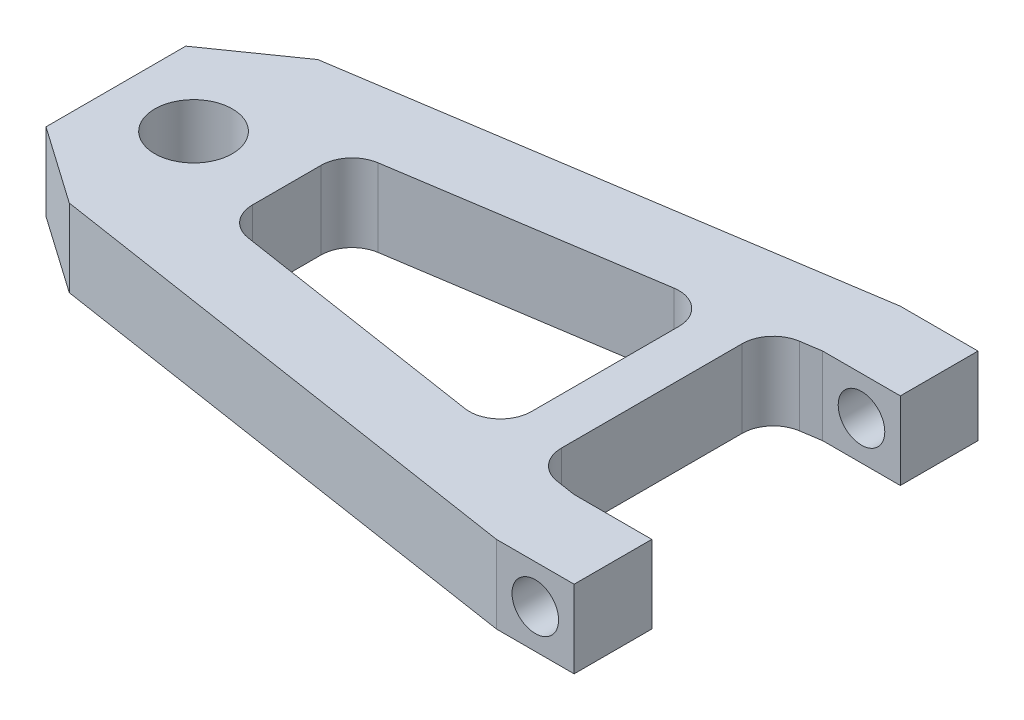
ISO-10303-21;
HEADER;
FILE_DESCRIPTION(('STEP AP214'),'2;1');
FILE_NAME('part.step','',(''),(''),'','','');
FILE_SCHEMA(('AUTOMOTIVE_DESIGN { 1 0 10303 214 1 1 1 1 }'));
ENDSEC;
DATA;
#1=APPLICATION_CONTEXT('core data for automotive mechanical design processes');
#2=APPLICATION_PROTOCOL_DEFINITION('international standard','automotive_design',2000,#1);
#3=PRODUCT_CONTEXT('',#1,'mechanical');
#4=PRODUCT('Part','Part','',(#3));
#5=PRODUCT_RELATED_PRODUCT_CATEGORY('part','',(#4));
#6=PRODUCT_DEFINITION_FORMATION('','',#4);
#7=PRODUCT_DEFINITION_CONTEXT('part definition',#1,'design');
#8=PRODUCT_DEFINITION('design','',#6,#7);
#9=PRODUCT_DEFINITION_SHAPE('','',#8);
#10=(LENGTH_UNIT() NAMED_UNIT(*) SI_UNIT(.MILLI.,.METRE.));
#11=(NAMED_UNIT(*) PLANE_ANGLE_UNIT() SI_UNIT($,.RADIAN.));
#12=(NAMED_UNIT(*) SI_UNIT($,.STERADIAN.) SOLID_ANGLE_UNIT());
#13=UNCERTAINTY_MEASURE_WITH_UNIT(LENGTH_MEASURE(1.E-05),#10,'distance_accuracy_value','');
#14=(GEOMETRIC_REPRESENTATION_CONTEXT(3) GLOBAL_UNCERTAINTY_ASSIGNED_CONTEXT((#13)) GLOBAL_UNIT_ASSIGNED_CONTEXT((#10,
#11,#12)) REPRESENTATION_CONTEXT('',''));
#15=CARTESIAN_POINT('',(0.,0.,0.));
#16=DIRECTION('',(0.,0.,1.));
#17=DIRECTION('',(1.,0.,0.));
#18=AXIS2_PLACEMENT_3D('',#15,#16,#17);
#19=CARTESIAN_POINT('',(31.5,5.,-5.82262362492833));
#20=DIRECTION('',(0.,1.,0.));
#21=DIRECTION('',(0.,0.,1.));
#22=AXIS2_PLACEMENT_3D('',#19,#20,#21);
#23=PLANE('',#22);
#24=DIRECTION('',(-0.988371697650617,0.,0.152057184253941));
#25=VECTOR('',#24,1.);
#26=CARTESIAN_POINT('',(0.,5.,-8.));
#27=LINE('',#26,#25);
#28=CARTESIAN_POINT('',(32.5,5.,-13.));
#29=VERTEX_POINT('',#28);
#30=CARTESIAN_POINT('',(0.,5.,-8.));
#31=VERTEX_POINT('',#30);
#32=EDGE_CURVE('E300',#29,#31,#27,.T.);
#33=ORIENTED_EDGE('',*,*,#32,.T.);
#34=DIRECTION('',(-0.819152044288993,0.,0.573576436351044));
#35=VECTOR('',#34,1.);
#36=CARTESIAN_POINT('',(0.,5.,-8.));
#37=LINE('',#36,#35);
#38=CARTESIAN_POINT('',(-5.,5.,-4.49896230895147));
#39=VERTEX_POINT('',#38);
#40=EDGE_CURVE('E304',#31,#39,#37,.T.);
#41=ORIENTED_EDGE('',*,*,#40,.T.);
#42=DIRECTION('',(0.,0.,1.));
#43=VECTOR('',#42,1.);
#44=CARTESIAN_POINT('',(-5.,5.,-4.49896230895147));
#45=LINE('',#44,#43);
#46=CARTESIAN_POINT('',(-5.,5.,4.49896230895147));
#47=VERTEX_POINT('',#46);
#48=EDGE_CURVE('E308',#39,#47,#45,.T.);
#49=ORIENTED_EDGE('',*,*,#48,.T.);
#50=DIRECTION('',(0.819152044288993,0.,0.573576436351044));
#51=VECTOR('',#50,1.);
#52=CARTESIAN_POINT('',(0.,5.,8.));
#53=LINE('',#52,#51);
#54=CARTESIAN_POINT('',(0.,5.,8.));
#55=VERTEX_POINT('',#54);
#56=EDGE_CURVE('E311',#47,#55,#53,.T.);
#57=ORIENTED_EDGE('',*,*,#56,.T.);
#58=DIRECTION('',(0.988371697650617,0.,0.152057184253941));
#59=VECTOR('',#58,1.);
#60=CARTESIAN_POINT('',(0.,5.,8.));
#61=LINE('',#60,#59);
#62=CARTESIAN_POINT('',(32.5,5.,13.));
#63=VERTEX_POINT('',#62);
#64=EDGE_CURVE('E314',#55,#63,#61,.T.);
#65=ORIENTED_EDGE('',*,*,#64,.T.);
#66=DIRECTION('',(1.,0.,0.));
#67=VECTOR('',#66,1.);
#68=CARTESIAN_POINT('',(32.5,5.,13.));
#69=LINE('',#68,#67);
#70=CARTESIAN_POINT('',(37.5,5.,13.));
#71=VERTEX_POINT('',#70);
#72=EDGE_CURVE('E317',#63,#71,#69,.T.);
#73=ORIENTED_EDGE('',*,*,#72,.T.);
#74=DIRECTION('',(0.,0.,-1.));
#75=VECTOR('',#74,1.);
#76=CARTESIAN_POINT('',(37.5,5.,13.));
#77=LINE('',#76,#75);
#78=CARTESIAN_POINT('',(37.5,5.,8.));
#79=VERTEX_POINT('',#78);
#80=EDGE_CURVE('E320',#71,#79,#77,.T.);
#81=ORIENTED_EDGE('',*,*,#80,.T.);
#82=DIRECTION('',(-1.,0.,0.));
#83=VECTOR('',#82,1.);
#84=CARTESIAN_POINT('',(37.5,5.,8.));
#85=LINE('',#84,#83);
#86=CARTESIAN_POINT('',(32.5,5.,8.));
#87=VERTEX_POINT('',#86);
#88=EDGE_CURVE('E323',#79,#87,#85,.T.);
#89=ORIENTED_EDGE('',*,*,#88,.T.);
#90=DIRECTION('',(-0.988371697650617,0.,-0.15205718425394));
#91=VECTOR('',#90,1.);
#92=CARTESIAN_POINT('',(32.5,5.,8.));
#93=LINE('',#92,#91);
#94=CARTESIAN_POINT('',(31.1958856314921,5.,7.79936702022956));
#95=VERTEX_POINT('',#94);
#96=EDGE_CURVE('E326',#87,#95,#93,.T.);
#97=ORIENTED_EDGE('',*,*,#96,.T.);
#98=CARTESIAN_POINT('',(31.5,5.,5.82262362492833));
#99=DIRECTION('',(0.,-1.,0.));
#100=DIRECTION('',(0.,0.,1.));
#101=AXIS2_PLACEMENT_3D('',#98,#99,#100);
#102=CIRCLE('',#101,2.);
#103=CARTESIAN_POINT('',(29.5,5.,5.82262362492831));
#104=VERTEX_POINT('',#103);
#105=EDGE_CURVE('E329',#95,#104,#102,.T.);
#106=ORIENTED_EDGE('',*,*,#105,.T.);
#107=DIRECTION('',(0.,0.,-1.));
#108=VECTOR('',#107,1.);
#109=CARTESIAN_POINT('',(29.5,5.,-5.82262362492832));
#110=LINE('',#109,#108);
#111=CARTESIAN_POINT('',(29.5,5.,-5.82262362492832));
#112=VERTEX_POINT('',#111);
#113=EDGE_CURVE('E332',#104,#112,#110,.T.);
#114=ORIENTED_EDGE('',*,*,#113,.T.);
#115=CARTESIAN_POINT('',(31.5,5.,-5.82262362492833));
#116=DIRECTION('',(0.,-1.,0.));
#117=DIRECTION('',(0.,0.,1.));
#118=AXIS2_PLACEMENT_3D('',#115,#116,#117);
#119=CIRCLE('',#118,2.);
#120=CARTESIAN_POINT('',(31.1958856314921,5.,-7.79936702022956));
#121=VERTEX_POINT('',#120);
#122=EDGE_CURVE('E335',#112,#121,#119,.T.);
#123=ORIENTED_EDGE('',*,*,#122,.T.);
#124=DIRECTION('',(0.988371697650617,0.,-0.152057184253941));
#125=VECTOR('',#124,1.);
#126=CARTESIAN_POINT('',(32.5,5.,-8.));
#127=LINE('',#126,#125);
#128=CARTESIAN_POINT('',(32.5,5.,-8.));
#129=VERTEX_POINT('',#128);
#130=EDGE_CURVE('E338',#121,#129,#127,.T.);
#131=ORIENTED_EDGE('',*,*,#130,.T.);
#132=DIRECTION('',(1.,0.,0.));
#133=VECTOR('',#132,1.);
#134=CARTESIAN_POINT('',(37.5,5.,-8.));
#135=LINE('',#134,#133);
#136=CARTESIAN_POINT('',(37.5,5.,-8.));
#137=VERTEX_POINT('',#136);
#138=EDGE_CURVE('E341',#129,#137,#135,.T.);
#139=ORIENTED_EDGE('',*,*,#138,.T.);
#140=DIRECTION('',(0.,0.,-1.));
#141=VECTOR('',#140,1.);
#142=CARTESIAN_POINT('',(37.5,5.,-13.));
#143=LINE('',#142,#141);
#144=CARTESIAN_POINT('',(37.5,5.,-13.));
#145=VERTEX_POINT('',#144);
#146=EDGE_CURVE('E344',#137,#145,#143,.T.);
#147=ORIENTED_EDGE('',*,*,#146,.T.);
#148=DIRECTION('',(-1.,0.,0.));
#149=VECTOR('',#148,1.);
#150=CARTESIAN_POINT('',(32.5,5.,-13.));
#151=LINE('',#150,#149);
#152=EDGE_CURVE('E347',#145,#29,#151,.T.);
#153=ORIENTED_EDGE('',*,*,#152,.T.);
#154=EDGE_LOOP('',(#33,#41,#49,#57,#65,#73,#81,#89,#97,#106,#114,#123,#131,#139,#147,#153));
#155=FACE_BOUND('',#154,.T.);
#156=CARTESIAN_POINT('',(0.,5.,0.));
#157=DIRECTION('',(0.,1.,0.));
#158=DIRECTION('',(0.,0.,1.));
#159=AXIS2_PLACEMENT_3D('',#156,#157,#158);
#160=CIRCLE('',#159,2.5);
#161=CARTESIAN_POINT('',(0.,5.,2.5));
#162=VERTEX_POINT('',#161);
#163=EDGE_CURVE('E292',#162,#162,#160,.T.);
#164=ORIENTED_EDGE('',*,*,#163,.F.);
#165=EDGE_LOOP('',(#164));
#166=FACE_BOUND('',#165,.T.);
#167=DIRECTION('',(0.,0.,1.));
#168=VECTOR('',#167,1.);
#169=CARTESIAN_POINT('',(6.,5.,-2.20723900954372));
#170=LINE('',#169,#168);
#171=CARTESIAN_POINT('',(6.,5.,-2.20723900954372));
#172=VERTEX_POINT('',#171);
#173=CARTESIAN_POINT('',(6.,5.,2.20723900954372));
#174=VERTEX_POINT('',#173);
#175=EDGE_CURVE('E210',#172,#174,#170,.T.);
#176=ORIENTED_EDGE('',*,*,#175,.F.);
#177=CARTESIAN_POINT('',(8.,5.,-2.20723900954372));
#178=DIRECTION('',(0.,1.,0.));
#179=DIRECTION('',(0.,0.,-1.));
#180=AXIS2_PLACEMENT_3D('',#177,#178,#179);
#181=CIRCLE('',#180,2.);
#182=CARTESIAN_POINT('',(7.69588563149212,5.,-4.18398240484495));
#183=VERTEX_POINT('',#182);
#184=EDGE_CURVE('E201',#183,#172,#181,.T.);
#185=ORIENTED_EDGE('',*,*,#184,.F.);
#186=DIRECTION('',(-0.988371697650617,0.,0.152057184253941));
#187=VECTOR('',#186,1.);
#188=CARTESIAN_POINT('',(24.1958856314921,5.,-6.72244394330648));
#189=LINE('',#188,#187);
#190=CARTESIAN_POINT('',(24.1958856314921,5.,-6.72244394330648));
#191=VERTEX_POINT('',#190);
#192=EDGE_CURVE('E243',#191,#183,#189,.T.);
#193=ORIENTED_EDGE('',*,*,#192,.F.);
#194=CARTESIAN_POINT('',(24.5,5.,-4.74570054800525));
#195=DIRECTION('',(0.,1.,0.));
#196=DIRECTION('',(0.,0.,1.));
#197=AXIS2_PLACEMENT_3D('',#194,#195,#196);
#198=CIRCLE('',#197,2.);
#199=CARTESIAN_POINT('',(26.5,5.,-4.74570054800524));
#200=VERTEX_POINT('',#199);
#201=EDGE_CURVE('E240',#200,#191,#198,.T.);
#202=ORIENTED_EDGE('',*,*,#201,.F.);
#203=DIRECTION('',(0.,0.,-1.));
#204=VECTOR('',#203,1.);
#205=CARTESIAN_POINT('',(26.5,5.,-4.74570054800524));
#206=LINE('',#205,#204);
#207=CARTESIAN_POINT('',(26.5,5.,4.74570054800524));
#208=VERTEX_POINT('',#207);
#209=EDGE_CURVE('E237',#208,#200,#206,.T.);
#210=ORIENTED_EDGE('',*,*,#209,.F.);
#211=CARTESIAN_POINT('',(24.5,5.,4.74570054800525));
#212=DIRECTION('',(0.,1.,0.));
#213=DIRECTION('',(0.,0.,-1.));
#214=AXIS2_PLACEMENT_3D('',#211,#212,#213);
#215=CIRCLE('',#214,2.);
#216=CARTESIAN_POINT('',(24.1958856314921,5.,6.72244394330648));
#217=VERTEX_POINT('',#216);
#218=EDGE_CURVE('E234',#217,#208,#215,.T.);
#219=ORIENTED_EDGE('',*,*,#218,.F.);
#220=DIRECTION('',(0.988371697650617,0.,0.152057184253941));
#221=VECTOR('',#220,1.);
#222=CARTESIAN_POINT('',(24.1958856314921,5.,6.72244394330648));
#223=LINE('',#222,#221);
#224=CARTESIAN_POINT('',(7.69588563149212,5.,4.18398240484495));
#225=VERTEX_POINT('',#224);
#226=EDGE_CURVE('E228',#225,#217,#223,.T.);
#227=ORIENTED_EDGE('',*,*,#226,.F.);
#228=CARTESIAN_POINT('',(8.,5.,2.20723900954372));
#229=DIRECTION('',(0.,1.,0.));
#230=DIRECTION('',(0.,0.,1.));
#231=AXIS2_PLACEMENT_3D('',#228,#229,#230);
#232=CIRCLE('',#231,2.);
#233=EDGE_CURVE('E224',#174,#225,#232,.T.);
#234=ORIENTED_EDGE('',*,*,#233,.F.);
#235=EDGE_LOOP('',(#176,#185,#193,#202,#210,#219,#227,#234));
#236=FACE_BOUND('',#235,.T.);
#237=ADVANCED_FACE('F39',(#155,#166,#236),#23,.T.);
#238=CARTESIAN_POINT('',(31.5,0.,-5.82262362492833));
#239=DIRECTION('',(0.,1.,0.));
#240=DIRECTION('',(0.,0.,1.));
#241=AXIS2_PLACEMENT_3D('',#238,#239,#240);
#242=PLANE('',#241);
#243=CARTESIAN_POINT('',(0.,0.,0.));
#244=DIRECTION('',(0.,1.,0.));
#245=DIRECTION('',(0.,0.,1.));
#246=AXIS2_PLACEMENT_3D('',#243,#244,#245);
#247=CIRCLE('',#246,2.5);
#248=CARTESIAN_POINT('',(0.,0.,2.5));
#249=VERTEX_POINT('',#248);
#250=EDGE_CURVE('E219',#249,#249,#247,.T.);
#251=ORIENTED_EDGE('',*,*,#250,.T.);
#252=EDGE_LOOP('',(#251));
#253=FACE_BOUND('',#252,.T.);
#254=DIRECTION('',(-0.988371697650617,0.,0.152057184253941));
#255=VECTOR('',#254,1.);
#256=CARTESIAN_POINT('',(0.,0.,-8.));
#257=LINE('',#256,#255);
#258=CARTESIAN_POINT('',(32.5,0.,-13.));
#259=VERTEX_POINT('',#258);
#260=CARTESIAN_POINT('',(0.,0.,-8.));
#261=VERTEX_POINT('',#260);
#262=EDGE_CURVE('E296',#259,#261,#257,.T.);
#263=ORIENTED_EDGE('',*,*,#262,.F.);
#264=DIRECTION('',(-1.,0.,0.));
#265=VECTOR('',#264,1.);
#266=CARTESIAN_POINT('',(32.5,0.,-13.));
#267=LINE('',#266,#265);
#268=CARTESIAN_POINT('',(37.5,0.,-13.));
#269=VERTEX_POINT('',#268);
#270=EDGE_CURVE('E305',#269,#259,#267,.T.);
#271=ORIENTED_EDGE('',*,*,#270,.F.);
#272=DIRECTION('',(0.,0.,-1.));
#273=VECTOR('',#272,1.);
#274=CARTESIAN_POINT('',(37.5,0.,-13.));
#275=LINE('',#274,#273);
#276=CARTESIAN_POINT('',(37.5,0.,-8.));
#277=VERTEX_POINT('',#276);
#278=EDGE_CURVE('E393',#277,#269,#275,.T.);
#279=ORIENTED_EDGE('',*,*,#278,.F.);
#280=DIRECTION('',(1.,0.,0.));
#281=VECTOR('',#280,1.);
#282=CARTESIAN_POINT('',(37.5,0.,-8.));
#283=LINE('',#282,#281);
#284=CARTESIAN_POINT('',(32.5,0.,-8.));
#285=VERTEX_POINT('',#284);
#286=EDGE_CURVE('E390',#285,#277,#283,.T.);
#287=ORIENTED_EDGE('',*,*,#286,.F.);
#288=DIRECTION('',(0.988371697650617,0.,-0.152057184253941));
#289=VECTOR('',#288,1.);
#290=CARTESIAN_POINT('',(32.5,0.,-8.));
#291=LINE('',#290,#289);
#292=CARTESIAN_POINT('',(31.1958856314921,0.,-7.79936702022956));
#293=VERTEX_POINT('',#292);
#294=EDGE_CURVE('E387',#293,#285,#291,.T.);
#295=ORIENTED_EDGE('',*,*,#294,.F.);
#296=CARTESIAN_POINT('',(31.5,0.,-5.82262362492833));
#297=DIRECTION('',(0.,-1.,0.));
#298=DIRECTION('',(0.,0.,1.));
#299=AXIS2_PLACEMENT_3D('',#296,#297,#298);
#300=CIRCLE('',#299,2.);
#301=CARTESIAN_POINT('',(29.5,0.,-5.82262362492832));
#302=VERTEX_POINT('',#301);
#303=EDGE_CURVE('E384',#302,#293,#300,.T.);
#304=ORIENTED_EDGE('',*,*,#303,.F.);
#305=DIRECTION('',(0.,0.,-1.));
#306=VECTOR('',#305,1.);
#307=CARTESIAN_POINT('',(29.5,0.,-5.82262362492832));
#308=LINE('',#307,#306);
#309=CARTESIAN_POINT('',(29.5,0.,5.82262362492831));
#310=VERTEX_POINT('',#309);
#311=EDGE_CURVE('E381',#310,#302,#308,.T.);
#312=ORIENTED_EDGE('',*,*,#311,.F.);
#313=CARTESIAN_POINT('',(31.5,0.,5.82262362492833));
#314=DIRECTION('',(0.,-1.,0.));
#315=DIRECTION('',(0.,0.,1.));
#316=AXIS2_PLACEMENT_3D('',#313,#314,#315);
#317=CIRCLE('',#316,2.);
#318=CARTESIAN_POINT('',(31.1958856314921,0.,7.79936702022956));
#319=VERTEX_POINT('',#318);
#320=EDGE_CURVE('E378',#319,#310,#317,.T.);
#321=ORIENTED_EDGE('',*,*,#320,.F.);
#322=DIRECTION('',(-0.988371697650617,0.,-0.15205718425394));
#323=VECTOR('',#322,1.);
#324=CARTESIAN_POINT('',(32.5,0.,8.));
#325=LINE('',#324,#323);
#326=CARTESIAN_POINT('',(32.5,0.,8.));
#327=VERTEX_POINT('',#326);
#328=EDGE_CURVE('E375',#327,#319,#325,.T.);
#329=ORIENTED_EDGE('',*,*,#328,.F.);
#330=DIRECTION('',(-1.,0.,0.));
#331=VECTOR('',#330,1.);
#332=CARTESIAN_POINT('',(37.5,0.,8.));
#333=LINE('',#332,#331);
#334=CARTESIAN_POINT('',(37.5,0.,8.));
#335=VERTEX_POINT('',#334);
#336=EDGE_CURVE('E372',#335,#327,#333,.T.);
#337=ORIENTED_EDGE('',*,*,#336,.F.);
#338=DIRECTION('',(0.,0.,-1.));
#339=VECTOR('',#338,1.);
#340=CARTESIAN_POINT('',(37.5,0.,13.));
#341=LINE('',#340,#339);
#342=CARTESIAN_POINT('',(37.5,0.,13.));
#343=VERTEX_POINT('',#342);
#344=EDGE_CURVE('E369',#343,#335,#341,.T.);
#345=ORIENTED_EDGE('',*,*,#344,.F.);
#346=DIRECTION('',(1.,0.,0.));
#347=VECTOR('',#346,1.);
#348=CARTESIAN_POINT('',(32.5,0.,13.));
#349=LINE('',#348,#347);
#350=CARTESIAN_POINT('',(32.5,0.,13.));
#351=VERTEX_POINT('',#350);
#352=EDGE_CURVE('E366',#351,#343,#349,.T.);
#353=ORIENTED_EDGE('',*,*,#352,.F.);
#354=DIRECTION('',(0.988371697650617,0.,0.152057184253941));
#355=VECTOR('',#354,1.);
#356=CARTESIAN_POINT('',(0.,0.,8.));
#357=LINE('',#356,#355);
#358=CARTESIAN_POINT('',(0.,0.,8.));
#359=VERTEX_POINT('',#358);
#360=EDGE_CURVE('E363',#359,#351,#357,.T.);
#361=ORIENTED_EDGE('',*,*,#360,.F.);
#362=DIRECTION('',(0.819152044288993,0.,0.573576436351044));
#363=VECTOR('',#362,1.);
#364=CARTESIAN_POINT('',(0.,0.,8.));
#365=LINE('',#364,#363);
#366=CARTESIAN_POINT('',(-5.,0.,4.49896230895147));
#367=VERTEX_POINT('',#366);
#368=EDGE_CURVE('E360',#367,#359,#365,.T.);
#369=ORIENTED_EDGE('',*,*,#368,.F.);
#370=DIRECTION('',(0.,0.,1.));
#371=VECTOR('',#370,1.);
#372=CARTESIAN_POINT('',(-5.,0.,-4.49896230895147));
#373=LINE('',#372,#371);
#374=CARTESIAN_POINT('',(-5.,0.,-4.49896230895147));
#375=VERTEX_POINT('',#374);
#376=EDGE_CURVE('E357',#375,#367,#373,.T.);
#377=ORIENTED_EDGE('',*,*,#376,.F.);
#378=DIRECTION('',(-0.819152044288993,0.,0.573576436351044));
#379=VECTOR('',#378,1.);
#380=CARTESIAN_POINT('',(0.,0.,-8.));
#381=LINE('',#380,#379);
#382=EDGE_CURVE('E354',#261,#375,#381,.T.);
#383=ORIENTED_EDGE('',*,*,#382,.F.);
#384=EDGE_LOOP('',(#263,#271,#279,#287,#295,#304,#312,#321,#329,#337,#345,#353,#361,#369,#377,#383));
#385=FACE_BOUND('',#384,.T.);
#386=CARTESIAN_POINT('',(8.,0.,-2.20723900954372));
#387=DIRECTION('',(0.,1.,0.));
#388=DIRECTION('',(0.,0.,-1.));
#389=AXIS2_PLACEMENT_3D('',#386,#387,#388);
#390=CIRCLE('',#389,2.);
#391=CARTESIAN_POINT('',(7.69588563149212,0.,-4.18398240484495));
#392=VERTEX_POINT('',#391);
#393=CARTESIAN_POINT('',(6.,0.,-2.20723900954372));
#394=VERTEX_POINT('',#393);
#395=EDGE_CURVE('E63',#392,#394,#390,.T.);
#396=ORIENTED_EDGE('',*,*,#395,.T.);
#397=DIRECTION('',(0.,0.,1.));
#398=VECTOR('',#397,1.);
#399=CARTESIAN_POINT('',(6.,0.,-2.20723900954372));
#400=LINE('',#399,#398);
#401=CARTESIAN_POINT('',(6.,0.,2.20723900954372));
#402=VERTEX_POINT('',#401);
#403=EDGE_CURVE('E217',#394,#402,#400,.T.);
#404=ORIENTED_EDGE('',*,*,#403,.T.);
#405=CARTESIAN_POINT('',(8.,0.,2.20723900954372));
#406=DIRECTION('',(0.,1.,0.));
#407=DIRECTION('',(0.,0.,1.));
#408=AXIS2_PLACEMENT_3D('',#405,#406,#407);
#409=CIRCLE('',#408,2.);
#410=CARTESIAN_POINT('',(7.69588563149212,0.,4.18398240484495));
#411=VERTEX_POINT('',#410);
#412=EDGE_CURVE('E251',#402,#411,#409,.T.);
#413=ORIENTED_EDGE('',*,*,#412,.T.);
#414=DIRECTION('',(0.988371697650617,0.,0.152057184253941));
#415=VECTOR('',#414,1.);
#416=CARTESIAN_POINT('',(24.1958856314921,0.,6.72244394330648));
#417=LINE('',#416,#415);
#418=CARTESIAN_POINT('',(24.1958856314921,0.,6.72244394330648));
#419=VERTEX_POINT('',#418);
#420=EDGE_CURVE('E255',#411,#419,#417,.T.);
#421=ORIENTED_EDGE('',*,*,#420,.T.);
#422=CARTESIAN_POINT('',(24.5,0.,4.74570054800525));
#423=DIRECTION('',(0.,1.,0.));
#424=DIRECTION('',(0.,0.,-1.));
#425=AXIS2_PLACEMENT_3D('',#422,#423,#424);
#426=CIRCLE('',#425,2.);
#427=CARTESIAN_POINT('',(26.5,0.,4.74570054800524));
#428=VERTEX_POINT('',#427);
#429=EDGE_CURVE('E259',#419,#428,#426,.T.);
#430=ORIENTED_EDGE('',*,*,#429,.T.);
#431=DIRECTION('',(0.,0.,-1.));
#432=VECTOR('',#431,1.);
#433=CARTESIAN_POINT('',(26.5,0.,-4.74570054800524));
#434=LINE('',#433,#432);
#435=CARTESIAN_POINT('',(26.5,0.,-4.74570054800524));
#436=VERTEX_POINT('',#435);
#437=EDGE_CURVE('E263',#428,#436,#434,.T.);
#438=ORIENTED_EDGE('',*,*,#437,.T.);
#439=CARTESIAN_POINT('',(24.5,0.,-4.74570054800525));
#440=DIRECTION('',(0.,1.,0.));
#441=DIRECTION('',(0.,0.,1.));
#442=AXIS2_PLACEMENT_3D('',#439,#440,#441);
#443=CIRCLE('',#442,2.);
#444=CARTESIAN_POINT('',(24.1958856314921,0.,-6.72244394330648));
#445=VERTEX_POINT('',#444);
#446=EDGE_CURVE('E267',#436,#445,#443,.T.);
#447=ORIENTED_EDGE('',*,*,#446,.T.);
#448=DIRECTION('',(-0.988371697650617,0.,0.152057184253941));
#449=VECTOR('',#448,1.);
#450=CARTESIAN_POINT('',(24.1958856314921,0.,-6.72244394330648));
#451=LINE('',#450,#449);
#452=EDGE_CURVE('E211',#445,#392,#451,.T.);
#453=ORIENTED_EDGE('',*,*,#452,.T.);
#454=EDGE_LOOP('',(#396,#404,#413,#421,#430,#438,#447,#453));
#455=FACE_BOUND('',#454,.T.);
#456=ADVANCED_FACE('F464',(#253,#385,#455),#242,.F.);
#457=CARTESIAN_POINT('',(0.,5.,-8.));
#458=DIRECTION('',(0.152057184253941,0.,0.988371697650617));
#459=DIRECTION('',(0.988371697650617,0.,-0.152057184253941));
#460=AXIS2_PLACEMENT_3D('',#457,#458,#459);
#461=PLANE('',#460);
#462=ORIENTED_EDGE('',*,*,#262,.T.);
#463=DIRECTION('',(0.,-1.,0.));
#464=VECTOR('',#463,1.);
#465=CARTESIAN_POINT('',(0.,5.,-8.));
#466=LINE('',#465,#464);
#467=EDGE_CURVE('E11',#31,#261,#466,.T.);
#468=ORIENTED_EDGE('',*,*,#467,.F.);
#469=ORIENTED_EDGE('',*,*,#32,.F.);
#470=DIRECTION('',(0.,-1.,0.));
#471=VECTOR('',#470,1.);
#472=CARTESIAN_POINT('',(32.5,5.,-13.));
#473=LINE('',#472,#471);
#474=EDGE_CURVE('E350',#29,#259,#473,.T.);
#475=ORIENTED_EDGE('',*,*,#474,.T.);
#476=EDGE_LOOP('',(#462,#468,#469,#475));
#477=FACE_BOUND('',#476,.T.);
#478=ADVANCED_FACE('F41',(#477),#461,.F.);
#479=CARTESIAN_POINT('',(0.,5.,-8.));
#480=DIRECTION('',(0.573576436351044,0.,0.819152044288993));
#481=DIRECTION('',(0.819152044288993,0.,-0.573576436351044));
#482=AXIS2_PLACEMENT_3D('',#479,#480,#481);
#483=PLANE('',#482);
#484=ORIENTED_EDGE('',*,*,#382,.T.);
#485=DIRECTION('',(0.,-1.,0.));
#486=VECTOR('',#485,1.);
#487=CARTESIAN_POINT('',(-5.,5.,-4.49896230895147));
#488=LINE('',#487,#486);
#489=EDGE_CURVE('E48',#39,#375,#488,.T.);
#490=ORIENTED_EDGE('',*,*,#489,.F.);
#491=ORIENTED_EDGE('',*,*,#40,.F.);
#492=ORIENTED_EDGE('',*,*,#467,.T.);
#493=EDGE_LOOP('',(#484,#490,#491,#492));
#494=FACE_BOUND('',#493,.T.);
#495=ADVANCED_FACE('F482',(#494),#483,.F.);
#496=CARTESIAN_POINT('',(-5.,5.,-4.49896230895147));
#497=DIRECTION('',(1.,0.,0.));
#498=DIRECTION('',(0.,0.,-1.));
#499=AXIS2_PLACEMENT_3D('',#496,#497,#498);
#500=PLANE('',#499);
#501=ORIENTED_EDGE('',*,*,#376,.T.);
#502=DIRECTION('',(0.,-1.,0.));
#503=VECTOR('',#502,1.);
#504=CARTESIAN_POINT('',(-5.,5.,4.49896230895147));
#505=LINE('',#504,#503);
#506=EDGE_CURVE('E449',#47,#367,#505,.T.);
#507=ORIENTED_EDGE('',*,*,#506,.F.);
#508=ORIENTED_EDGE('',*,*,#48,.F.);
#509=ORIENTED_EDGE('',*,*,#489,.T.);
#510=EDGE_LOOP('',(#501,#507,#508,#509));
#511=FACE_BOUND('',#510,.T.);
#512=ADVANCED_FACE('F458',(#511),#500,.F.);
#513=CARTESIAN_POINT('',(0.,5.,8.));
#514=DIRECTION('',(0.573576436351044,0.,-0.819152044288993));
#515=DIRECTION('',(-0.819152044288993,0.,-0.573576436351044));
#516=AXIS2_PLACEMENT_3D('',#513,#514,#515);
#517=PLANE('',#516);
#518=ORIENTED_EDGE('',*,*,#368,.T.);
#519=DIRECTION('',(0.,-1.,0.));
#520=VECTOR('',#519,1.);
#521=CARTESIAN_POINT('',(0.,5.,8.));
#522=LINE('',#521,#520);
#523=EDGE_CURVE('E445',#55,#359,#522,.T.);
#524=ORIENTED_EDGE('',*,*,#523,.F.);
#525=ORIENTED_EDGE('',*,*,#56,.F.);
#526=ORIENTED_EDGE('',*,*,#506,.T.);
#527=EDGE_LOOP('',(#518,#524,#525,#526));
#528=FACE_BOUND('',#527,.T.);
#529=ADVANCED_FACE('F470',(#528),#517,.F.);
#530=CARTESIAN_POINT('',(0.,5.,8.));
#531=DIRECTION('',(0.152057184253941,0.,-0.988371697650617));
#532=DIRECTION('',(-0.988371697650617,0.,-0.152057184253941));
#533=AXIS2_PLACEMENT_3D('',#530,#531,#532);
#534=PLANE('',#533);
#535=ORIENTED_EDGE('',*,*,#360,.T.);
#536=DIRECTION('',(0.,-1.,0.));
#537=VECTOR('',#536,1.);
#538=CARTESIAN_POINT('',(32.5,5.,13.));
#539=LINE('',#538,#537);
#540=EDGE_CURVE('E441',#63,#351,#539,.T.);
#541=ORIENTED_EDGE('',*,*,#540,.F.);
#542=ORIENTED_EDGE('',*,*,#64,.F.);
#543=ORIENTED_EDGE('',*,*,#523,.T.);
#544=EDGE_LOOP('',(#535,#541,#542,#543));
#545=FACE_BOUND('',#544,.T.);
#546=ADVANCED_FACE('F474',(#545),#534,.F.);
#547=CARTESIAN_POINT('',(32.5,5.,13.));
#548=DIRECTION('',(0.,0.,-1.));
#549=DIRECTION('',(-1.,0.,0.));
#550=AXIS2_PLACEMENT_3D('',#547,#548,#549);
#551=PLANE('',#550);
#552=CARTESIAN_POINT('',(35.,2.5,13.));
#553=DIRECTION('',(0.,0.,1.));
#554=DIRECTION('',(1.,0.,0.));
#555=AXIS2_PLACEMENT_3D('',#552,#553,#554);
#556=CIRCLE('',#555,1.5);
#557=CARTESIAN_POINT('',(36.5,2.5,13.));
#558=VERTEX_POINT('',#557);
#559=EDGE_CURVE('E589',#558,#558,#556,.T.);
#560=ORIENTED_EDGE('',*,*,#559,.F.);
#561=EDGE_LOOP('',(#560));
#562=FACE_BOUND('',#561,.T.);
#563=ORIENTED_EDGE('',*,*,#352,.T.);
#564=DIRECTION('',(0.,-1.,0.));
#565=VECTOR('',#564,1.);
#566=CARTESIAN_POINT('',(37.5,5.,13.));
#567=LINE('',#566,#565);
#568=EDGE_CURVE('E437',#71,#343,#567,.T.);
#569=ORIENTED_EDGE('',*,*,#568,.F.);
#570=ORIENTED_EDGE('',*,*,#72,.F.);
#571=ORIENTED_EDGE('',*,*,#540,.T.);
#572=EDGE_LOOP('',(#563,#569,#570,#571));
#573=FACE_BOUND('',#572,.T.);
#574=ADVANCED_FACE('F535',(#562,#573),#551,.F.);
#575=CARTESIAN_POINT('',(37.5,5.,13.));
#576=DIRECTION('',(-1.,0.,0.));
#577=DIRECTION('',(0.,0.,1.));
#578=AXIS2_PLACEMENT_3D('',#575,#576,#577);
#579=PLANE('',#578);
#580=ORIENTED_EDGE('',*,*,#344,.T.);
#581=DIRECTION('',(0.,-1.,0.));
#582=VECTOR('',#581,1.);
#583=CARTESIAN_POINT('',(37.5,5.,8.));
#584=LINE('',#583,#582);
#585=EDGE_CURVE('E433',#79,#335,#584,.T.);
#586=ORIENTED_EDGE('',*,*,#585,.F.);
#587=ORIENTED_EDGE('',*,*,#80,.F.);
#588=ORIENTED_EDGE('',*,*,#568,.T.);
#589=EDGE_LOOP('',(#580,#586,#587,#588));
#590=FACE_BOUND('',#589,.T.);
#591=ADVANCED_FACE('F532',(#590),#579,.F.);
#592=CARTESIAN_POINT('',(37.5,5.,8.));
#593=DIRECTION('',(0.,0.,1.));
#594=DIRECTION('',(1.,0.,0.));
#595=AXIS2_PLACEMENT_3D('',#592,#593,#594);
#596=PLANE('',#595);
#597=CARTESIAN_POINT('',(35.,2.5,8.));
#598=DIRECTION('',(0.,0.,1.));
#599=DIRECTION('',(1.,0.,0.));
#600=AXIS2_PLACEMENT_3D('',#597,#598,#599);
#601=CIRCLE('',#600,1.5);
#602=CARTESIAN_POINT('',(36.5,2.5,8.));
#603=VERTEX_POINT('',#602);
#604=EDGE_CURVE('E248',#603,#603,#601,.T.);
#605=ORIENTED_EDGE('',*,*,#604,.T.);
#606=EDGE_LOOP('',(#605));
#607=FACE_BOUND('',#606,.T.);
#608=ORIENTED_EDGE('',*,*,#336,.T.);
#609=DIRECTION('',(0.,-1.,0.));
#610=VECTOR('',#609,1.);
#611=CARTESIAN_POINT('',(32.5,5.,8.));
#612=LINE('',#611,#610);
#613=EDGE_CURVE('E429',#87,#327,#612,.T.);
#614=ORIENTED_EDGE('',*,*,#613,.F.);
#615=ORIENTED_EDGE('',*,*,#88,.F.);
#616=ORIENTED_EDGE('',*,*,#585,.T.);
#617=EDGE_LOOP('',(#608,#614,#615,#616));
#618=FACE_BOUND('',#617,.T.);
#619=ADVANCED_FACE('F528',(#607,#618),#596,.F.);
#620=CARTESIAN_POINT('',(32.5,5.,8.));
#621=DIRECTION('',(-0.15205718425394,0.,0.988371697650617));
#622=DIRECTION('',(0.988371697650617,0.,0.15205718425394));
#623=AXIS2_PLACEMENT_3D('',#620,#621,#622);
#624=PLANE('',#623);
#625=ORIENTED_EDGE('',*,*,#328,.T.);
#626=DIRECTION('',(0.,-1.,0.));
#627=VECTOR('',#626,1.);
#628=CARTESIAN_POINT('',(31.1958856314921,5.,7.79936702022956));
#629=LINE('',#628,#627);
#630=EDGE_CURVE('E425',#95,#319,#629,.T.);
#631=ORIENTED_EDGE('',*,*,#630,.F.);
#632=ORIENTED_EDGE('',*,*,#96,.F.);
#633=ORIENTED_EDGE('',*,*,#613,.T.);
#634=EDGE_LOOP('',(#625,#631,#632,#633));
#635=FACE_BOUND('',#634,.T.);
#636=ADVANCED_FACE('F524',(#635),#624,.F.);
#637=CARTESIAN_POINT('',(31.5,5.,5.82262362492833));
#638=DIRECTION('',(0.,-1.,0.));
#639=DIRECTION('',(0.,0.,-1.));
#640=AXIS2_PLACEMENT_3D('',#637,#638,#639);
#641=CYLINDRICAL_SURFACE('',#640,2.);
#642=ORIENTED_EDGE('',*,*,#320,.T.);
#643=DIRECTION('',(0.,-1.,0.));
#644=VECTOR('',#643,1.);
#645=CARTESIAN_POINT('',(29.5,5.,5.82262362492831));
#646=LINE('',#645,#644);
#647=EDGE_CURVE('E421',#104,#310,#646,.T.);
#648=ORIENTED_EDGE('',*,*,#647,.F.);
#649=ORIENTED_EDGE('',*,*,#105,.F.);
#650=ORIENTED_EDGE('',*,*,#630,.T.);
#651=EDGE_LOOP('',(#642,#648,#649,#650));
#652=FACE_BOUND('',#651,.T.);
#653=ADVANCED_FACE('F519',(#652),#641,.F.);
#654=CARTESIAN_POINT('',(29.5,5.,-5.82262362492832));
#655=DIRECTION('',(-1.,0.,0.));
#656=DIRECTION('',(0.,0.,1.));
#657=AXIS2_PLACEMENT_3D('',#654,#655,#656);
#658=PLANE('',#657);
#659=ORIENTED_EDGE('',*,*,#311,.T.);
#660=DIRECTION('',(0.,-1.,0.));
#661=VECTOR('',#660,1.);
#662=CARTESIAN_POINT('',(29.5,5.,-5.82262362492832));
#663=LINE('',#662,#661);
#664=EDGE_CURVE('E417',#112,#302,#663,.T.);
#665=ORIENTED_EDGE('',*,*,#664,.F.);
#666=ORIENTED_EDGE('',*,*,#113,.F.);
#667=ORIENTED_EDGE('',*,*,#647,.T.);
#668=EDGE_LOOP('',(#659,#665,#666,#667));
#669=FACE_BOUND('',#668,.T.);
#670=ADVANCED_FACE('F513',(#669),#658,.F.);
#671=CARTESIAN_POINT('',(31.5,5.,-5.82262362492833));
#672=DIRECTION('',(0.,-1.,0.));
#673=DIRECTION('',(0.,0.,-1.));
#674=AXIS2_PLACEMENT_3D('',#671,#672,#673);
#675=CYLINDRICAL_SURFACE('',#674,2.);
#676=ORIENTED_EDGE('',*,*,#303,.T.);
#677=DIRECTION('',(0.,-1.,0.));
#678=VECTOR('',#677,1.);
#679=CARTESIAN_POINT('',(31.1958856314921,5.,-7.79936702022956));
#680=LINE('',#679,#678);
#681=EDGE_CURVE('E413',#121,#293,#680,.T.);
#682=ORIENTED_EDGE('',*,*,#681,.F.);
#683=ORIENTED_EDGE('',*,*,#122,.F.);
#684=ORIENTED_EDGE('',*,*,#664,.T.);
#685=EDGE_LOOP('',(#676,#682,#683,#684));
#686=FACE_BOUND('',#685,.T.);
#687=ADVANCED_FACE('F509',(#686),#675,.F.);
#688=CARTESIAN_POINT('',(32.5,5.,-8.));
#689=DIRECTION('',(-0.152057184253941,0.,-0.988371697650617));
#690=DIRECTION('',(-0.988371697650617,0.,0.152057184253941));
#691=AXIS2_PLACEMENT_3D('',#688,#689,#690);
#692=PLANE('',#691);
#693=ORIENTED_EDGE('',*,*,#294,.T.);
#694=DIRECTION('',(0.,-1.,0.));
#695=VECTOR('',#694,1.);
#696=CARTESIAN_POINT('',(32.5,5.,-8.));
#697=LINE('',#696,#695);
#698=EDGE_CURVE('E409',#129,#285,#697,.T.);
#699=ORIENTED_EDGE('',*,*,#698,.F.);
#700=ORIENTED_EDGE('',*,*,#130,.F.);
#701=ORIENTED_EDGE('',*,*,#681,.T.);
#702=EDGE_LOOP('',(#693,#699,#700,#701));
#703=FACE_BOUND('',#702,.T.);
#704=ADVANCED_FACE('F504',(#703),#692,.F.);
#705=CARTESIAN_POINT('',(37.5,5.,-8.));
#706=DIRECTION('',(0.,0.,-1.));
#707=DIRECTION('',(-1.,0.,0.));
#708=AXIS2_PLACEMENT_3D('',#705,#706,#707);
#709=PLANE('',#708);
#710=CARTESIAN_POINT('',(35.,2.5,-8.));
#711=DIRECTION('',(0.,0.,-1.));
#712=DIRECTION('',(-1.,0.,0.));
#713=AXIS2_PLACEMENT_3D('',#710,#711,#712);
#714=CIRCLE('',#713,1.5);
#715=CARTESIAN_POINT('',(33.5,2.5,-8.));
#716=VERTEX_POINT('',#715);
#717=EDGE_CURVE('E583',#716,#716,#714,.T.);
#718=ORIENTED_EDGE('',*,*,#717,.T.);
#719=EDGE_LOOP('',(#718));
#720=FACE_BOUND('',#719,.T.);
#721=ORIENTED_EDGE('',*,*,#286,.T.);
#722=DIRECTION('',(0.,-1.,0.));
#723=VECTOR('',#722,1.);
#724=CARTESIAN_POINT('',(37.5,5.,-8.));
#725=LINE('',#724,#723);
#726=EDGE_CURVE('E405',#137,#277,#725,.T.);
#727=ORIENTED_EDGE('',*,*,#726,.F.);
#728=ORIENTED_EDGE('',*,*,#138,.F.);
#729=ORIENTED_EDGE('',*,*,#698,.T.);
#730=EDGE_LOOP('',(#721,#727,#728,#729));
#731=FACE_BOUND('',#730,.T.);
#732=ADVANCED_FACE('F498',(#720,#731),#709,.F.);
#733=CARTESIAN_POINT('',(37.5,5.,-13.));
#734=DIRECTION('',(-1.,0.,0.));
#735=DIRECTION('',(0.,0.,1.));
#736=AXIS2_PLACEMENT_3D('',#733,#734,#735);
#737=PLANE('',#736);
#738=ORIENTED_EDGE('',*,*,#278,.T.);
#739=DIRECTION('',(0.,-1.,0.));
#740=VECTOR('',#739,1.);
#741=CARTESIAN_POINT('',(37.5,5.,-13.));
#742=LINE('',#741,#740);
#743=EDGE_CURVE('E401',#145,#269,#742,.T.);
#744=ORIENTED_EDGE('',*,*,#743,.F.);
#745=ORIENTED_EDGE('',*,*,#146,.F.);
#746=ORIENTED_EDGE('',*,*,#726,.T.);
#747=EDGE_LOOP('',(#738,#744,#745,#746));
#748=FACE_BOUND('',#747,.T.);
#749=ADVANCED_FACE('F494',(#748),#737,.F.);
#750=CARTESIAN_POINT('',(32.5,5.,-13.));
#751=DIRECTION('',(0.,0.,1.));
#752=DIRECTION('',(1.,0.,0.));
#753=AXIS2_PLACEMENT_3D('',#750,#751,#752);
#754=PLANE('',#753);
#755=CARTESIAN_POINT('',(35.,2.5,-13.));
#756=DIRECTION('',(0.,0.,1.));
#757=DIRECTION('',(1.,0.,0.));
#758=AXIS2_PLACEMENT_3D('',#755,#756,#757);
#759=CIRCLE('',#758,1.5);
#760=CARTESIAN_POINT('',(36.5,2.5,-13.));
#761=VERTEX_POINT('',#760);
#762=EDGE_CURVE('E586',#761,#761,#759,.T.);
#763=ORIENTED_EDGE('',*,*,#762,.T.);
#764=EDGE_LOOP('',(#763));
#765=FACE_BOUND('',#764,.T.);
#766=ORIENTED_EDGE('',*,*,#270,.T.);
#767=ORIENTED_EDGE('',*,*,#474,.F.);
#768=ORIENTED_EDGE('',*,*,#152,.F.);
#769=ORIENTED_EDGE('',*,*,#743,.T.);
#770=EDGE_LOOP('',(#766,#767,#768,#769));
#771=FACE_BOUND('',#770,.T.);
#772=ADVANCED_FACE('F489',(#765,#771),#754,.F.);
#773=CARTESIAN_POINT('',(0.,5.,0.));
#774=DIRECTION('',(0.,-1.,0.));
#775=DIRECTION('',(0.,0.,-1.));
#776=AXIS2_PLACEMENT_3D('',#773,#774,#775);
#777=CYLINDRICAL_SURFACE('',#776,2.5);
#778=ORIENTED_EDGE('',*,*,#163,.T.);
#779=EDGE_LOOP('',(#778));
#780=FACE_BOUND('',#779,.T.);
#781=ORIENTED_EDGE('',*,*,#250,.F.);
#782=EDGE_LOOP('',(#781));
#783=FACE_BOUND('',#782,.T.);
#784=ADVANCED_FACE('F554',(#780,#783),#777,.F.);
#785=CARTESIAN_POINT('',(8.,5.,-2.20723900954372));
#786=DIRECTION('',(0.,-1.,0.));
#787=DIRECTION('',(0.,0.,-1.));
#788=AXIS2_PLACEMENT_3D('',#785,#786,#787);
#789=CYLINDRICAL_SURFACE('',#788,2.);
#790=ORIENTED_EDGE('',*,*,#395,.F.);
#791=DIRECTION('',(0.,-1.,0.));
#792=VECTOR('',#791,1.);
#793=CARTESIAN_POINT('',(7.69588563149212,5.,-4.18398240484495));
#794=LINE('',#793,#792);
#795=EDGE_CURVE('E205',#183,#392,#794,.T.);
#796=ORIENTED_EDGE('',*,*,#795,.F.);
#797=ORIENTED_EDGE('',*,*,#184,.T.);
#798=DIRECTION('',(0.,-1.,0.));
#799=VECTOR('',#798,1.);
#800=CARTESIAN_POINT('',(6.,5.,-2.20723900954372));
#801=LINE('',#800,#799);
#802=EDGE_CURVE('E204',#172,#394,#801,.T.);
#803=ORIENTED_EDGE('',*,*,#802,.T.);
#804=EDGE_LOOP('',(#790,#796,#797,#803));
#805=FACE_BOUND('',#804,.T.);
#806=ADVANCED_FACE('F203',(#805),#789,.F.);
#807=CARTESIAN_POINT('',(6.,5.,-2.20723900954372));
#808=DIRECTION('',(1.,0.,0.));
#809=DIRECTION('',(0.,0.,-1.));
#810=AXIS2_PLACEMENT_3D('',#807,#808,#809);
#811=PLANE('',#810);
#812=ORIENTED_EDGE('',*,*,#403,.F.);
#813=ORIENTED_EDGE('',*,*,#802,.F.);
#814=ORIENTED_EDGE('',*,*,#175,.T.);
#815=DIRECTION('',(0.,-1.,0.));
#816=VECTOR('',#815,1.);
#817=CARTESIAN_POINT('',(6.,5.,2.20723900954372));
#818=LINE('',#817,#816);
#819=EDGE_CURVE('E220',#174,#402,#818,.T.);
#820=ORIENTED_EDGE('',*,*,#819,.T.);
#821=EDGE_LOOP('',(#812,#813,#814,#820));
#822=FACE_BOUND('',#821,.T.);
#823=ADVANCED_FACE('F214',(#822),#811,.T.);
#824=CARTESIAN_POINT('',(8.,5.,2.20723900954372));
#825=DIRECTION('',(0.,-1.,0.));
#826=DIRECTION('',(0.,0.,-1.));
#827=AXIS2_PLACEMENT_3D('',#824,#825,#826);
#828=CYLINDRICAL_SURFACE('',#827,2.);
#829=ORIENTED_EDGE('',*,*,#412,.F.);
#830=ORIENTED_EDGE('',*,*,#819,.F.);
#831=ORIENTED_EDGE('',*,*,#233,.T.);
#832=DIRECTION('',(0.,-1.,0.));
#833=VECTOR('',#832,1.);
#834=CARTESIAN_POINT('',(7.69588563149212,5.,4.18398240484495));
#835=LINE('',#834,#833);
#836=EDGE_CURVE('E287',#225,#411,#835,.T.);
#837=ORIENTED_EDGE('',*,*,#836,.T.);
#838=EDGE_LOOP('',(#829,#830,#831,#837));
#839=FACE_BOUND('',#838,.T.);
#840=ADVANCED_FACE('F626',(#839),#828,.F.);
#841=CARTESIAN_POINT('',(24.1958856314921,5.,6.72244394330648));
#842=DIRECTION('',(0.152057184253941,0.,-0.988371697650617));
#843=DIRECTION('',(-0.988371697650617,0.,-0.152057184253941));
#844=AXIS2_PLACEMENT_3D('',#841,#842,#843);
#845=PLANE('',#844);
#846=ORIENTED_EDGE('',*,*,#420,.F.);
#847=ORIENTED_EDGE('',*,*,#836,.F.);
#848=ORIENTED_EDGE('',*,*,#226,.T.);
#849=DIRECTION('',(0.,-1.,0.));
#850=VECTOR('',#849,1.);
#851=CARTESIAN_POINT('',(24.1958856314921,5.,6.72244394330648));
#852=LINE('',#851,#850);
#853=EDGE_CURVE('E284',#217,#419,#852,.T.);
#854=ORIENTED_EDGE('',*,*,#853,.T.);
#855=EDGE_LOOP('',(#846,#847,#848,#854));
#856=FACE_BOUND('',#855,.T.);
#857=ADVANCED_FACE('F622',(#856),#845,.T.);
#858=CARTESIAN_POINT('',(24.5,5.,4.74570054800525));
#859=DIRECTION('',(0.,-1.,0.));
#860=DIRECTION('',(0.,0.,-1.));
#861=AXIS2_PLACEMENT_3D('',#858,#859,#860);
#862=CYLINDRICAL_SURFACE('',#861,2.);
#863=ORIENTED_EDGE('',*,*,#429,.F.);
#864=ORIENTED_EDGE('',*,*,#853,.F.);
#865=ORIENTED_EDGE('',*,*,#218,.T.);
#866=DIRECTION('',(0.,-1.,0.));
#867=VECTOR('',#866,1.);
#868=CARTESIAN_POINT('',(26.5,5.,4.74570054800524));
#869=LINE('',#868,#867);
#870=EDGE_CURVE('E281',#208,#428,#869,.T.);
#871=ORIENTED_EDGE('',*,*,#870,.T.);
#872=EDGE_LOOP('',(#863,#864,#865,#871));
#873=FACE_BOUND('',#872,.T.);
#874=ADVANCED_FACE('F618',(#873),#862,.F.);
#875=CARTESIAN_POINT('',(26.5,5.,-4.74570054800524));
#876=DIRECTION('',(-1.,0.,0.));
#877=DIRECTION('',(0.,0.,1.));
#878=AXIS2_PLACEMENT_3D('',#875,#876,#877);
#879=PLANE('',#878);
#880=ORIENTED_EDGE('',*,*,#437,.F.);
#881=ORIENTED_EDGE('',*,*,#870,.F.);
#882=ORIENTED_EDGE('',*,*,#209,.T.);
#883=DIRECTION('',(0.,-1.,0.));
#884=VECTOR('',#883,1.);
#885=CARTESIAN_POINT('',(26.5,5.,-4.74570054800524));
#886=LINE('',#885,#884);
#887=EDGE_CURVE('E278',#200,#436,#886,.T.);
#888=ORIENTED_EDGE('',*,*,#887,.T.);
#889=EDGE_LOOP('',(#880,#881,#882,#888));
#890=FACE_BOUND('',#889,.T.);
#891=ADVANCED_FACE('F614',(#890),#879,.T.);
#892=CARTESIAN_POINT('',(24.5,5.,-4.74570054800525));
#893=DIRECTION('',(0.,-1.,0.));
#894=DIRECTION('',(0.,0.,-1.));
#895=AXIS2_PLACEMENT_3D('',#892,#893,#894);
#896=CYLINDRICAL_SURFACE('',#895,2.);
#897=ORIENTED_EDGE('',*,*,#446,.F.);
#898=ORIENTED_EDGE('',*,*,#887,.F.);
#899=ORIENTED_EDGE('',*,*,#201,.T.);
#900=DIRECTION('',(0.,-1.,0.));
#901=VECTOR('',#900,1.);
#902=CARTESIAN_POINT('',(24.1958856314921,5.,-6.72244394330648));
#903=LINE('',#902,#901);
#904=EDGE_CURVE('E55',#191,#445,#903,.T.);
#905=ORIENTED_EDGE('',*,*,#904,.T.);
#906=EDGE_LOOP('',(#897,#898,#899,#905));
#907=FACE_BOUND('',#906,.T.);
#908=ADVANCED_FACE('F609',(#907),#896,.F.);
#909=CARTESIAN_POINT('',(24.1958856314921,5.,-6.72244394330648));
#910=DIRECTION('',(0.152057184253941,0.,0.988371697650617));
#911=DIRECTION('',(0.988371697650617,0.,-0.152057184253941));
#912=AXIS2_PLACEMENT_3D('',#909,#910,#911);
#913=PLANE('',#912);
#914=ORIENTED_EDGE('',*,*,#452,.F.);
#915=ORIENTED_EDGE('',*,*,#904,.F.);
#916=ORIENTED_EDGE('',*,*,#192,.T.);
#917=ORIENTED_EDGE('',*,*,#795,.T.);
#918=EDGE_LOOP('',(#914,#915,#916,#917));
#919=FACE_BOUND('',#918,.T.);
#920=ADVANCED_FACE('F601',(#919),#913,.T.);
#921=CARTESIAN_POINT('',(35.,2.5,-13.));
#922=DIRECTION('',(0.,0.,1.));
#923=DIRECTION('',(1.,0.,0.));
#924=AXIS2_PLACEMENT_3D('',#921,#922,#923);
#925=CYLINDRICAL_SURFACE('',#924,1.5);
#926=ORIENTED_EDGE('',*,*,#762,.F.);
#927=EDGE_LOOP('',(#926));
#928=FACE_BOUND('',#927,.T.);
#929=ORIENTED_EDGE('',*,*,#717,.F.);
#930=EDGE_LOOP('',(#929));
#931=FACE_BOUND('',#930,.T.);
#932=ADVANCED_FACE('F597',(#928,#931),#925,.F.);
#933=ORIENTED_EDGE('',*,*,#559,.T.);
#934=EDGE_LOOP('',(#933));
#935=FACE_BOUND('',#934,.T.);
#936=ORIENTED_EDGE('',*,*,#604,.F.);
#937=EDGE_LOOP('',(#936));
#938=FACE_BOUND('',#937,.T.);
#939=ADVANCED_FACE('F600',(#935,#938),#925,.F.);
#940=CLOSED_SHELL('',(#237,#456,#478,#495,#512,#529,#546,#574,#591,#619,#636,#653,#670,#687,
#704,#732,#749,#772,#784,#806,#823,#840,#857,#874,#891,#908,#920,#932,#939));
#941=MANIFOLD_SOLID_BREP('B2',#940);
#942=ADVANCED_BREP_SHAPE_REPRESENTATION('',(#18,#941),#14);
#943=SHAPE_DEFINITION_REPRESENTATION(#9,#942);
ENDSEC;
END-ISO-10303-21;
